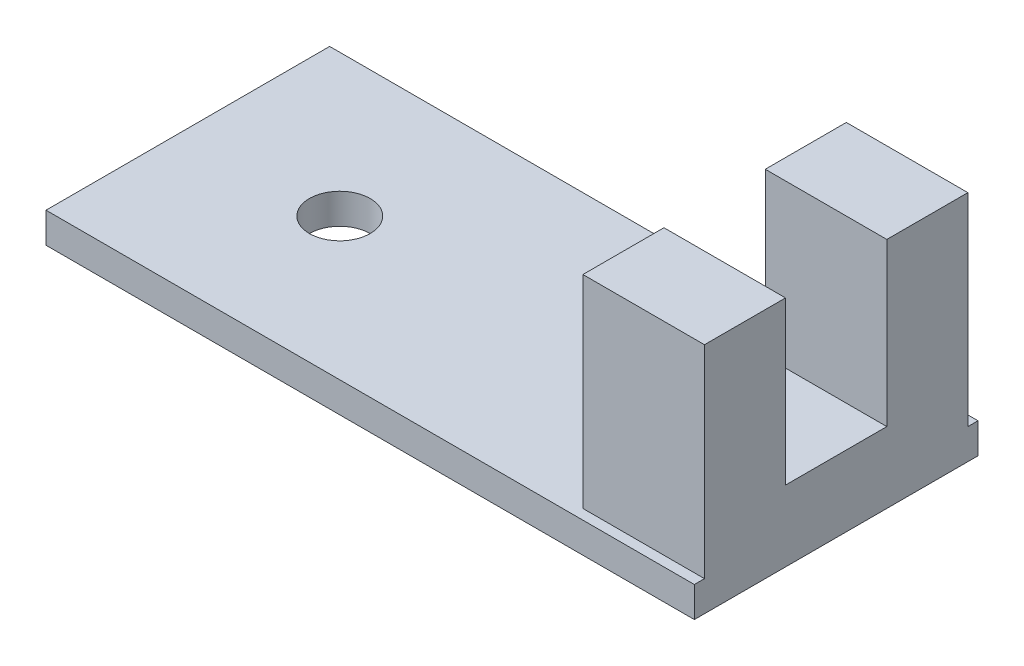
ISO-10303-21;
HEADER;
FILE_DESCRIPTION(('STEP AP214'),'2;1');
FILE_NAME('part.step','',(''),(''),'','','');
FILE_SCHEMA(('AUTOMOTIVE_DESIGN { 1 0 10303 214 1 1 1 1 }'));
ENDSEC;
DATA;
#1=APPLICATION_CONTEXT('core data for automotive mechanical design processes');
#2=APPLICATION_PROTOCOL_DEFINITION('international standard','automotive_design',2000,#1);
#3=PRODUCT_CONTEXT('',#1,'mechanical');
#4=PRODUCT('Part','Part','',(#3));
#5=PRODUCT_RELATED_PRODUCT_CATEGORY('part','',(#4));
#6=PRODUCT_DEFINITION_FORMATION('','',#4);
#7=PRODUCT_DEFINITION_CONTEXT('part definition',#1,'design');
#8=PRODUCT_DEFINITION('design','',#6,#7);
#9=PRODUCT_DEFINITION_SHAPE('','',#8);
#10=(LENGTH_UNIT() NAMED_UNIT(*) SI_UNIT(.MILLI.,.METRE.));
#11=(NAMED_UNIT(*) PLANE_ANGLE_UNIT() SI_UNIT($,.RADIAN.));
#12=(NAMED_UNIT(*) SI_UNIT($,.STERADIAN.) SOLID_ANGLE_UNIT());
#13=UNCERTAINTY_MEASURE_WITH_UNIT(LENGTH_MEASURE(1.E-05),#10,'distance_accuracy_value','');
#14=(GEOMETRIC_REPRESENTATION_CONTEXT(3) GLOBAL_UNCERTAINTY_ASSIGNED_CONTEXT((#13)) GLOBAL_UNIT_ASSIGNED_CONTEXT((#10,
#11,#12)) REPRESENTATION_CONTEXT('',''));
#15=CARTESIAN_POINT('',(0.,0.,0.));
#16=DIRECTION('',(0.,0.,1.));
#17=DIRECTION('',(1.,0.,0.));
#18=AXIS2_PLACEMENT_3D('',#15,#16,#17);
#19=CARTESIAN_POINT('',(0.,3.5,0.));
#20=DIRECTION('',(0.,-1.,0.));
#21=DIRECTION('',(0.,0.,-1.));
#22=AXIS2_PLACEMENT_3D('',#19,#20,#21);
#23=PLANE('',#22);
#24=DIRECTION('',(-1.,0.,0.));
#25=VECTOR('',#24,1.);
#26=CARTESIAN_POINT('',(10.,3.5,2.5));
#27=LINE('',#26,#25);
#28=CARTESIAN_POINT('',(16.,3.5,2.5));
#29=VERTEX_POINT('',#28);
#30=CARTESIAN_POINT('',(10.,3.5,2.5));
#31=VERTEX_POINT('',#30);
#32=EDGE_CURVE('E54',#29,#31,#27,.T.);
#33=ORIENTED_EDGE('',*,*,#32,.F.);
#34=DIRECTION('',(0.,0.,-1.));
#35=VECTOR('',#34,1.);
#36=CARTESIAN_POINT('',(16.,3.5,-6.5));
#37=LINE('',#36,#35);
#38=CARTESIAN_POINT('',(16.,3.5,-2.5));
#39=VERTEX_POINT('',#38);
#40=EDGE_CURVE('E40',#29,#39,#37,.T.);
#41=ORIENTED_EDGE('',*,*,#40,.T.);
#42=DIRECTION('',(1.,0.,0.));
#43=VECTOR('',#42,1.);
#44=CARTESIAN_POINT('',(10.,3.5,-2.5));
#45=LINE('',#44,#43);
#46=CARTESIAN_POINT('',(10.,3.5,-2.5));
#47=VERTEX_POINT('',#46);
#48=EDGE_CURVE('E162',#47,#39,#45,.T.);
#49=ORIENTED_EDGE('',*,*,#48,.F.);
#50=DIRECTION('',(0.,0.,1.));
#51=VECTOR('',#50,1.);
#52=CARTESIAN_POINT('',(10.,3.5,6.5));
#53=LINE('',#52,#51);
#54=EDGE_CURVE('E59',#47,#31,#53,.T.);
#55=ORIENTED_EDGE('',*,*,#54,.T.);
#56=EDGE_LOOP('',(#33,#41,#49,#55));
#57=FACE_BOUND('',#56,.T.);
#58=ADVANCED_FACE('F36',(#57),#23,.F.);
#59=CARTESIAN_POINT('',(0.,1.5,0.));
#60=DIRECTION('',(0.,-1.,0.));
#61=DIRECTION('',(0.,0.,-1.));
#62=AXIS2_PLACEMENT_3D('',#59,#60,#61);
#63=PLANE('',#62);
#64=CARTESIAN_POINT('',(-8.5,1.5,0.));
#65=DIRECTION('',(0.,1.,0.));
#66=DIRECTION('',(0.,0.,1.));
#67=AXIS2_PLACEMENT_3D('',#64,#65,#66);
#68=CIRCLE('',#67,1.5);
#69=CARTESIAN_POINT('',(-8.5,1.5,1.5));
#70=VERTEX_POINT('',#69);
#71=EDGE_CURVE('E263',#70,#70,#68,.T.);
#72=ORIENTED_EDGE('',*,*,#71,.F.);
#73=EDGE_LOOP('',(#72));
#74=FACE_BOUND('',#73,.T.);
#75=DIRECTION('',(-1.,0.,0.));
#76=VECTOR('',#75,1.);
#77=CARTESIAN_POINT('',(10.,1.5,-6.5));
#78=LINE('',#77,#76);
#79=CARTESIAN_POINT('',(16.,1.5,-6.5));
#80=VERTEX_POINT('',#79);
#81=CARTESIAN_POINT('',(10.,1.5,-6.5));
#82=VERTEX_POINT('',#81);
#83=EDGE_CURVE('E194',#80,#82,#78,.T.);
#84=ORIENTED_EDGE('',*,*,#83,.F.);
#85=DIRECTION('',(0.,0.,-1.));
#86=VECTOR('',#85,1.);
#87=CARTESIAN_POINT('',(16.,1.5,7.));
#88=LINE('',#87,#86);
#89=CARTESIAN_POINT('',(16.,1.5,-7.));
#90=VERTEX_POINT('',#89);
#91=EDGE_CURVE('E203',#80,#90,#88,.T.);
#92=ORIENTED_EDGE('',*,*,#91,.T.);
#93=DIRECTION('',(-1.,0.,0.));
#94=VECTOR('',#93,1.);
#95=CARTESIAN_POINT('',(-16.,1.5,-7.));
#96=LINE('',#95,#94);
#97=CARTESIAN_POINT('',(-16.,1.5,-7.));
#98=VERTEX_POINT('',#97);
#99=EDGE_CURVE('E235',#90,#98,#96,.T.);
#100=ORIENTED_EDGE('',*,*,#99,.T.);
#101=DIRECTION('',(0.,0.,1.));
#102=VECTOR('',#101,1.);
#103=CARTESIAN_POINT('',(-16.,1.5,7.));
#104=LINE('',#103,#102);
#105=CARTESIAN_POINT('',(-16.,1.5,7.));
#106=VERTEX_POINT('',#105);
#107=EDGE_CURVE('E259',#98,#106,#104,.T.);
#108=ORIENTED_EDGE('',*,*,#107,.T.);
#109=DIRECTION('',(1.,0.,0.));
#110=VECTOR('',#109,1.);
#111=CARTESIAN_POINT('',(-16.,1.5,7.));
#112=LINE('',#111,#110);
#113=CARTESIAN_POINT('',(16.,1.5,7.));
#114=VERTEX_POINT('',#113);
#115=EDGE_CURVE('E250',#106,#114,#112,.T.);
#116=ORIENTED_EDGE('',*,*,#115,.T.);
#117=CARTESIAN_POINT('',(16.,1.5,6.5));
#118=VERTEX_POINT('',#117);
#119=EDGE_CURVE('E233',#114,#118,#88,.T.);
#120=ORIENTED_EDGE('',*,*,#119,.T.);
#121=DIRECTION('',(1.,0.,0.));
#122=VECTOR('',#121,1.);
#123=CARTESIAN_POINT('',(16.,1.5,6.5));
#124=LINE('',#123,#122);
#125=CARTESIAN_POINT('',(10.,1.5,6.5));
#126=VERTEX_POINT('',#125);
#127=EDGE_CURVE('E192',#126,#118,#124,.T.);
#128=ORIENTED_EDGE('',*,*,#127,.F.);
#129=DIRECTION('',(0.,0.,1.));
#130=VECTOR('',#129,1.);
#131=CARTESIAN_POINT('',(10.,1.5,6.5));
#132=LINE('',#131,#130);
#133=EDGE_CURVE('E134',#82,#126,#132,.T.);
#134=ORIENTED_EDGE('',*,*,#133,.F.);
#135=EDGE_LOOP('',(#84,#92,#100,#108,#116,#120,#128,#134));
#136=FACE_BOUND('',#135,.T.);
#137=ADVANCED_FACE('F230',(#74,#136),#63,.F.);
#138=CARTESIAN_POINT('',(0.,0.,0.));
#139=DIRECTION('',(0.,-1.,0.));
#140=DIRECTION('',(0.,0.,-1.));
#141=AXIS2_PLACEMENT_3D('',#138,#139,#140);
#142=PLANE('',#141);
#143=DIRECTION('',(0.,0.,-1.));
#144=VECTOR('',#143,1.);
#145=CARTESIAN_POINT('',(16.,0.,7.));
#146=LINE('',#145,#144);
#147=CARTESIAN_POINT('',(16.,0.,7.));
#148=VERTEX_POINT('',#147);
#149=CARTESIAN_POINT('',(16.,0.,-7.));
#150=VERTEX_POINT('',#149);
#151=EDGE_CURVE('E262',#148,#150,#146,.T.);
#152=ORIENTED_EDGE('',*,*,#151,.F.);
#153=DIRECTION('',(1.,0.,0.));
#154=VECTOR('',#153,1.);
#155=CARTESIAN_POINT('',(-16.,0.,7.));
#156=LINE('',#155,#154);
#157=CARTESIAN_POINT('',(-16.,0.,7.));
#158=VERTEX_POINT('',#157);
#159=EDGE_CURVE('E234',#158,#148,#156,.T.);
#160=ORIENTED_EDGE('',*,*,#159,.F.);
#161=DIRECTION('',(0.,0.,1.));
#162=VECTOR('',#161,1.);
#163=CARTESIAN_POINT('',(-16.,0.,7.));
#164=LINE('',#163,#162);
#165=CARTESIAN_POINT('',(-16.,0.,-7.));
#166=VERTEX_POINT('',#165);
#167=EDGE_CURVE('E236',#166,#158,#164,.T.);
#168=ORIENTED_EDGE('',*,*,#167,.F.);
#169=DIRECTION('',(-1.,0.,0.));
#170=VECTOR('',#169,1.);
#171=CARTESIAN_POINT('',(-16.,0.,-7.));
#172=LINE('',#171,#170);
#173=EDGE_CURVE('E243',#150,#166,#172,.T.);
#174=ORIENTED_EDGE('',*,*,#173,.F.);
#175=EDGE_LOOP('',(#152,#160,#168,#174));
#176=FACE_BOUND('',#175,.T.);
#177=CARTESIAN_POINT('',(-8.5,0.,0.));
#178=DIRECTION('',(0.,1.,0.));
#179=DIRECTION('',(0.,0.,1.));
#180=AXIS2_PLACEMENT_3D('',#177,#178,#179);
#181=CIRCLE('',#180,1.5);
#182=CARTESIAN_POINT('',(-8.5,0.,1.5));
#183=VERTEX_POINT('',#182);
#184=EDGE_CURVE('E137',#183,#183,#181,.T.);
#185=ORIENTED_EDGE('',*,*,#184,.T.);
#186=EDGE_LOOP('',(#185));
#187=FACE_BOUND('',#186,.T.);
#188=ADVANCED_FACE('F274',(#176,#187),#142,.T.);
#189=CARTESIAN_POINT('',(16.,1.5,7.));
#190=DIRECTION('',(-1.,0.,0.));
#191=DIRECTION('',(0.,0.,1.));
#192=AXIS2_PLACEMENT_3D('',#189,#190,#191);
#193=PLANE('',#192);
#194=ORIENTED_EDGE('',*,*,#151,.T.);
#195=DIRECTION('',(0.,-1.,0.));
#196=VECTOR('',#195,1.);
#197=CARTESIAN_POINT('',(16.,1.5,-7.));
#198=LINE('',#197,#196);
#199=EDGE_CURVE('E11',#90,#150,#198,.T.);
#200=ORIENTED_EDGE('',*,*,#199,.F.);
#201=ORIENTED_EDGE('',*,*,#91,.F.);
#202=DIRECTION('',(0.,-1.,0.));
#203=VECTOR('',#202,1.);
#204=CARTESIAN_POINT('',(16.,3.5,-6.5));
#205=LINE('',#204,#203);
#206=CARTESIAN_POINT('',(16.,11.5,-6.5));
#207=VERTEX_POINT('',#206);
#208=EDGE_CURVE('E207',#207,#80,#205,.T.);
#209=ORIENTED_EDGE('',*,*,#208,.F.);
#210=DIRECTION('',(0.,0.,-1.));
#211=VECTOR('',#210,1.);
#212=CARTESIAN_POINT('',(16.,11.5,-6.5));
#213=LINE('',#212,#211);
#214=CARTESIAN_POINT('',(16.,11.5,-2.5));
#215=VERTEX_POINT('',#214);
#216=EDGE_CURVE('E168',#215,#207,#213,.T.);
#217=ORIENTED_EDGE('',*,*,#216,.F.);
#218=DIRECTION('',(0.,-1.,0.));
#219=VECTOR('',#218,1.);
#220=CARTESIAN_POINT('',(16.,11.5,-2.5));
#221=LINE('',#220,#219);
#222=EDGE_CURVE('E174',#215,#39,#221,.T.);
#223=ORIENTED_EDGE('',*,*,#222,.T.);
#224=ORIENTED_EDGE('',*,*,#40,.F.);
#225=DIRECTION('',(0.,-1.,0.));
#226=VECTOR('',#225,1.);
#227=CARTESIAN_POINT('',(16.,11.5,2.5));
#228=LINE('',#227,#226);
#229=CARTESIAN_POINT('',(16.,11.5,2.5));
#230=VERTEX_POINT('',#229);
#231=EDGE_CURVE('E159',#230,#29,#228,.T.);
#232=ORIENTED_EDGE('',*,*,#231,.F.);
#233=DIRECTION('',(0.,0.,-1.));
#234=VECTOR('',#233,1.);
#235=CARTESIAN_POINT('',(16.,11.5,6.5));
#236=LINE('',#235,#234);
#237=CARTESIAN_POINT('',(16.,11.5,6.5));
#238=VERTEX_POINT('',#237);
#239=EDGE_CURVE('E146',#238,#230,#236,.T.);
#240=ORIENTED_EDGE('',*,*,#239,.F.);
#241=DIRECTION('',(0.,-1.,0.));
#242=VECTOR('',#241,1.);
#243=CARTESIAN_POINT('',(16.,3.5,6.5));
#244=LINE('',#243,#242);
#245=EDGE_CURVE('E138',#238,#118,#244,.T.);
#246=ORIENTED_EDGE('',*,*,#245,.T.);
#247=ORIENTED_EDGE('',*,*,#119,.F.);
#248=DIRECTION('',(0.,-1.,0.));
#249=VECTOR('',#248,1.);
#250=CARTESIAN_POINT('',(16.,1.5,7.));
#251=LINE('',#250,#249);
#252=EDGE_CURVE('E247',#114,#148,#251,.T.);
#253=ORIENTED_EDGE('',*,*,#252,.T.);
#254=EDGE_LOOP('',(#194,#200,#201,#209,#217,#223,#224,#232,#240,#246,#247,#253));
#255=FACE_BOUND('',#254,.T.);
#256=ADVANCED_FACE('F38',(#255),#193,.F.);
#257=CARTESIAN_POINT('',(-16.,1.5,-7.));
#258=DIRECTION('',(0.,0.,1.));
#259=DIRECTION('',(1.,0.,0.));
#260=AXIS2_PLACEMENT_3D('',#257,#258,#259);
#261=PLANE('',#260);
#262=ORIENTED_EDGE('',*,*,#173,.T.);
#263=DIRECTION('',(0.,-1.,0.));
#264=VECTOR('',#263,1.);
#265=CARTESIAN_POINT('',(-16.,1.5,-7.));
#266=LINE('',#265,#264);
#267=EDGE_CURVE('E46',#98,#166,#266,.T.);
#268=ORIENTED_EDGE('',*,*,#267,.F.);
#269=ORIENTED_EDGE('',*,*,#99,.F.);
#270=ORIENTED_EDGE('',*,*,#199,.T.);
#271=EDGE_LOOP('',(#262,#268,#269,#270));
#272=FACE_BOUND('',#271,.T.);
#273=ADVANCED_FACE('F266',(#272),#261,.F.);
#274=CARTESIAN_POINT('',(-16.,1.5,7.));
#275=DIRECTION('',(1.,0.,0.));
#276=DIRECTION('',(0.,0.,-1.));
#277=AXIS2_PLACEMENT_3D('',#274,#275,#276);
#278=PLANE('',#277);
#279=ORIENTED_EDGE('',*,*,#167,.T.);
#280=DIRECTION('',(0.,-1.,0.));
#281=VECTOR('',#280,1.);
#282=CARTESIAN_POINT('',(-16.,1.5,7.));
#283=LINE('',#282,#281);
#284=EDGE_CURVE('E249',#106,#158,#283,.T.);
#285=ORIENTED_EDGE('',*,*,#284,.F.);
#286=ORIENTED_EDGE('',*,*,#107,.F.);
#287=ORIENTED_EDGE('',*,*,#267,.T.);
#288=EDGE_LOOP('',(#279,#285,#286,#287));
#289=FACE_BOUND('',#288,.T.);
#290=ADVANCED_FACE('F272',(#289),#278,.F.);
#291=CARTESIAN_POINT('',(-16.,1.5,7.));
#292=DIRECTION('',(0.,0.,-1.));
#293=DIRECTION('',(-1.,0.,0.));
#294=AXIS2_PLACEMENT_3D('',#291,#292,#293);
#295=PLANE('',#294);
#296=ORIENTED_EDGE('',*,*,#159,.T.);
#297=ORIENTED_EDGE('',*,*,#252,.F.);
#298=ORIENTED_EDGE('',*,*,#115,.F.);
#299=ORIENTED_EDGE('',*,*,#284,.T.);
#300=EDGE_LOOP('',(#296,#297,#298,#299));
#301=FACE_BOUND('',#300,.T.);
#302=ADVANCED_FACE('F278',(#301),#295,.F.);
#303=CARTESIAN_POINT('',(-8.5,1.5,0.));
#304=DIRECTION('',(0.,-1.,0.));
#305=DIRECTION('',(0.,0.,-1.));
#306=AXIS2_PLACEMENT_3D('',#303,#304,#305);
#307=CYLINDRICAL_SURFACE('',#306,1.5);
#308=ORIENTED_EDGE('',*,*,#71,.T.);
#309=EDGE_LOOP('',(#308));
#310=FACE_BOUND('',#309,.T.);
#311=ORIENTED_EDGE('',*,*,#184,.F.);
#312=EDGE_LOOP('',(#311));
#313=FACE_BOUND('',#312,.T.);
#314=ADVANCED_FACE('F304',(#310,#313),#307,.F.);
#315=CARTESIAN_POINT('',(10.,3.5,6.5));
#316=DIRECTION('',(1.,0.,0.));
#317=DIRECTION('',(0.,0.,-1.));
#318=AXIS2_PLACEMENT_3D('',#315,#316,#317);
#319=PLANE('',#318);
#320=ORIENTED_EDGE('',*,*,#133,.T.);
#321=DIRECTION('',(0.,-1.,0.));
#322=VECTOR('',#321,1.);
#323=CARTESIAN_POINT('',(10.,3.5,6.5));
#324=LINE('',#323,#322);
#325=CARTESIAN_POINT('',(10.,11.5,6.5));
#326=VERTEX_POINT('',#325);
#327=EDGE_CURVE('E127',#326,#126,#324,.T.);
#328=ORIENTED_EDGE('',*,*,#327,.F.);
#329=DIRECTION('',(0.,0.,1.));
#330=VECTOR('',#329,1.);
#331=CARTESIAN_POINT('',(10.,11.5,6.5));
#332=LINE('',#331,#330);
#333=CARTESIAN_POINT('',(10.,11.5,2.5));
#334=VERTEX_POINT('',#333);
#335=EDGE_CURVE('E132',#334,#326,#332,.T.);
#336=ORIENTED_EDGE('',*,*,#335,.F.);
#337=DIRECTION('',(0.,-1.,0.));
#338=VECTOR('',#337,1.);
#339=CARTESIAN_POINT('',(10.,11.5,2.5));
#340=LINE('',#339,#338);
#341=EDGE_CURVE('E156',#334,#31,#340,.T.);
#342=ORIENTED_EDGE('',*,*,#341,.T.);
#343=ORIENTED_EDGE('',*,*,#54,.F.);
#344=DIRECTION('',(0.,-1.,0.));
#345=VECTOR('',#344,1.);
#346=CARTESIAN_POINT('',(10.,11.5,-2.5));
#347=LINE('',#346,#345);
#348=CARTESIAN_POINT('',(10.,11.5,-2.5));
#349=VERTEX_POINT('',#348);
#350=EDGE_CURVE('E185',#349,#47,#347,.T.);
#351=ORIENTED_EDGE('',*,*,#350,.F.);
#352=DIRECTION('',(0.,0.,1.));
#353=VECTOR('',#352,1.);
#354=CARTESIAN_POINT('',(10.,11.5,-6.5));
#355=LINE('',#354,#353);
#356=CARTESIAN_POINT('',(10.,11.5,-6.5));
#357=VERTEX_POINT('',#356);
#358=EDGE_CURVE('E163',#357,#349,#355,.T.);
#359=ORIENTED_EDGE('',*,*,#358,.F.);
#360=DIRECTION('',(0.,-1.,0.));
#361=VECTOR('',#360,1.);
#362=CARTESIAN_POINT('',(10.,3.5,-6.5));
#363=LINE('',#362,#361);
#364=EDGE_CURVE('E200',#357,#82,#363,.T.);
#365=ORIENTED_EDGE('',*,*,#364,.T.);
#366=EDGE_LOOP('',(#320,#328,#336,#342,#343,#351,#359,#365));
#367=FACE_BOUND('',#366,.T.);
#368=ADVANCED_FACE('F129',(#367),#319,.F.);
#369=CARTESIAN_POINT('',(16.,3.5,6.5));
#370=DIRECTION('',(0.,0.,-1.));
#371=DIRECTION('',(-1.,0.,0.));
#372=AXIS2_PLACEMENT_3D('',#369,#370,#371);
#373=PLANE('',#372);
#374=ORIENTED_EDGE('',*,*,#127,.T.);
#375=ORIENTED_EDGE('',*,*,#245,.F.);
#376=DIRECTION('',(1.,0.,0.));
#377=VECTOR('',#376,1.);
#378=CARTESIAN_POINT('',(10.,11.5,6.5));
#379=LINE('',#378,#377);
#380=EDGE_CURVE('E141',#326,#238,#379,.T.);
#381=ORIENTED_EDGE('',*,*,#380,.F.);
#382=ORIENTED_EDGE('',*,*,#327,.T.);
#383=EDGE_LOOP('',(#374,#375,#381,#382));
#384=FACE_BOUND('',#383,.T.);
#385=ADVANCED_FACE('F142',(#384),#373,.F.);
#386=CARTESIAN_POINT('',(10.,3.5,-6.5));
#387=DIRECTION('',(0.,0.,1.));
#388=DIRECTION('',(1.,0.,0.));
#389=AXIS2_PLACEMENT_3D('',#386,#387,#388);
#390=PLANE('',#389);
#391=ORIENTED_EDGE('',*,*,#83,.T.);
#392=ORIENTED_EDGE('',*,*,#364,.F.);
#393=DIRECTION('',(-1.,0.,0.));
#394=VECTOR('',#393,1.);
#395=CARTESIAN_POINT('',(10.,11.5,-6.5));
#396=LINE('',#395,#394);
#397=EDGE_CURVE('E171',#207,#357,#396,.T.);
#398=ORIENTED_EDGE('',*,*,#397,.F.);
#399=ORIENTED_EDGE('',*,*,#208,.T.);
#400=EDGE_LOOP('',(#391,#392,#398,#399));
#401=FACE_BOUND('',#400,.T.);
#402=ADVANCED_FACE('F228',(#401),#390,.F.);
#403=CARTESIAN_POINT('',(10.,11.5,-2.5));
#404=DIRECTION('',(0.,0.,-1.));
#405=DIRECTION('',(-1.,0.,0.));
#406=AXIS2_PLACEMENT_3D('',#403,#404,#405);
#407=PLANE('',#406);
#408=ORIENTED_EDGE('',*,*,#48,.T.);
#409=ORIENTED_EDGE('',*,*,#222,.F.);
#410=DIRECTION('',(1.,0.,0.));
#411=VECTOR('',#410,1.);
#412=CARTESIAN_POINT('',(10.,11.5,-2.5));
#413=LINE('',#412,#411);
#414=EDGE_CURVE('E166',#349,#215,#413,.T.);
#415=ORIENTED_EDGE('',*,*,#414,.F.);
#416=ORIENTED_EDGE('',*,*,#350,.T.);
#417=EDGE_LOOP('',(#408,#409,#415,#416));
#418=FACE_BOUND('',#417,.T.);
#419=ADVANCED_FACE('F222',(#418),#407,.F.);
#420=CARTESIAN_POINT('',(0.,11.5,0.));
#421=DIRECTION('',(0.,1.,0.));
#422=DIRECTION('',(0.,0.,1.));
#423=AXIS2_PLACEMENT_3D('',#420,#421,#422);
#424=PLANE('',#423);
#425=ORIENTED_EDGE('',*,*,#358,.T.);
#426=ORIENTED_EDGE('',*,*,#414,.T.);
#427=ORIENTED_EDGE('',*,*,#216,.T.);
#428=ORIENTED_EDGE('',*,*,#397,.T.);
#429=EDGE_LOOP('',(#425,#426,#427,#428));
#430=FACE_BOUND('',#429,.T.);
#431=ADVANCED_FACE('F227',(#430),#424,.T.);
#432=CARTESIAN_POINT('',(10.,11.5,2.5));
#433=DIRECTION('',(0.,0.,1.));
#434=DIRECTION('',(1.,0.,0.));
#435=AXIS2_PLACEMENT_3D('',#432,#433,#434);
#436=PLANE('',#435);
#437=ORIENTED_EDGE('',*,*,#32,.T.);
#438=ORIENTED_EDGE('',*,*,#341,.F.);
#439=DIRECTION('',(-1.,0.,0.));
#440=VECTOR('',#439,1.);
#441=CARTESIAN_POINT('',(10.,11.5,2.5));
#442=LINE('',#441,#440);
#443=EDGE_CURVE('E150',#230,#334,#442,.T.);
#444=ORIENTED_EDGE('',*,*,#443,.F.);
#445=ORIENTED_EDGE('',*,*,#231,.T.);
#446=EDGE_LOOP('',(#437,#438,#444,#445));
#447=FACE_BOUND('',#446,.T.);
#448=ADVANCED_FACE('F280',(#447),#436,.F.);
#449=CARTESIAN_POINT('',(0.,11.5,0.));
#450=DIRECTION('',(0.,-1.,0.));
#451=DIRECTION('',(0.,0.,-1.));
#452=AXIS2_PLACEMENT_3D('',#449,#450,#451);
#453=PLANE('',#452);
#454=ORIENTED_EDGE('',*,*,#335,.T.);
#455=ORIENTED_EDGE('',*,*,#380,.T.);
#456=ORIENTED_EDGE('',*,*,#239,.T.);
#457=ORIENTED_EDGE('',*,*,#443,.T.);
#458=EDGE_LOOP('',(#454,#455,#456,#457));
#459=FACE_BOUND('',#458,.T.);
#460=ADVANCED_FACE('F148',(#459),#453,.F.);
#461=CLOSED_SHELL('',(#58,#137,#188,#256,#273,#290,#302,#314,#368,#385,#402,#419,#431,#448,#460));
#462=MANIFOLD_SOLID_BREP('B2',#461);
#463=ADVANCED_BREP_SHAPE_REPRESENTATION('',(#18,#462),#14);
#464=SHAPE_DEFINITION_REPRESENTATION(#9,#463);
ENDSEC;
END-ISO-10303-21;
